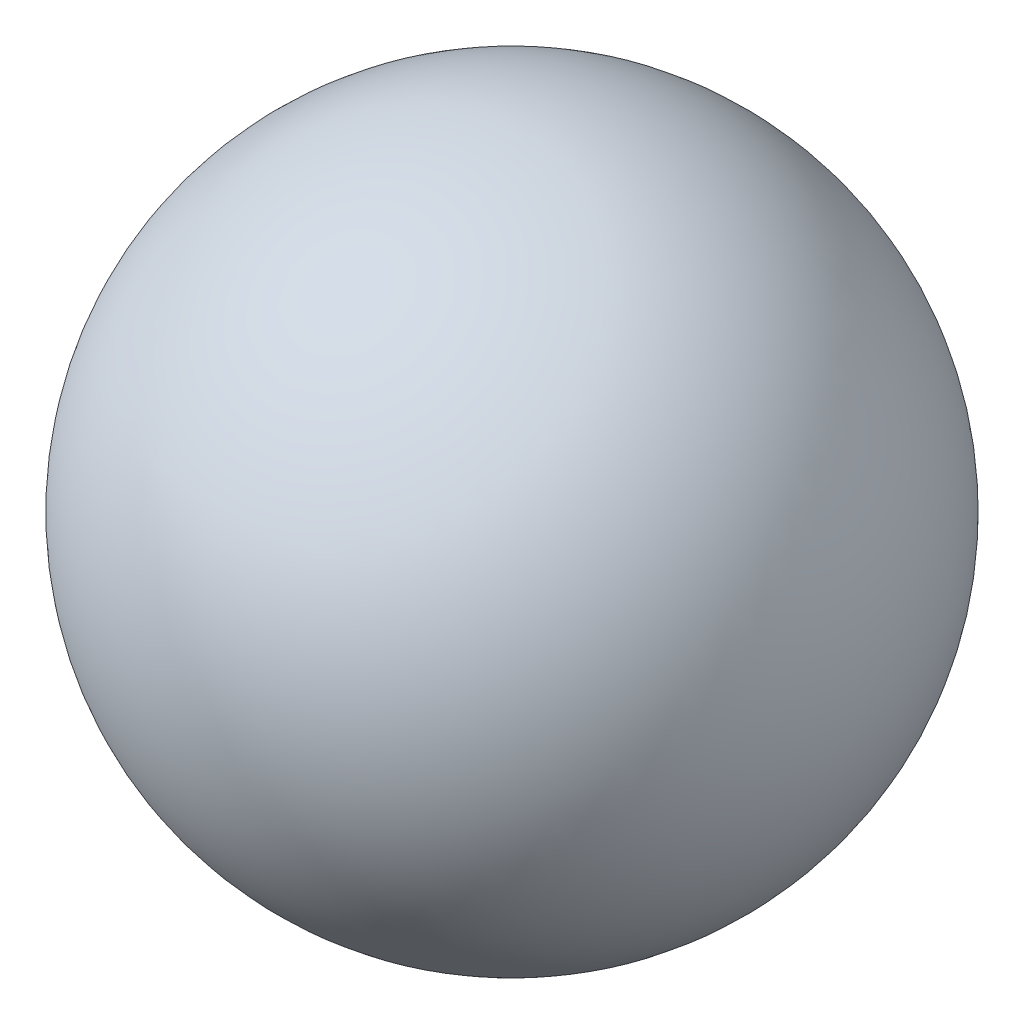
ISO-10303-21;
HEADER;
FILE_DESCRIPTION(('STEP AP214'),'2;1');
FILE_NAME('part.step','',(''),(''),'','','');
FILE_SCHEMA(('AUTOMOTIVE_DESIGN { 1 0 10303 214 1 1 1 1 }'));
ENDSEC;
DATA;
#1=APPLICATION_CONTEXT('core data for automotive mechanical design processes');
#2=APPLICATION_PROTOCOL_DEFINITION('international standard','automotive_design',2000,#1);
#3=PRODUCT_CONTEXT('',#1,'mechanical');
#4=PRODUCT('Part','Part','',(#3));
#5=PRODUCT_RELATED_PRODUCT_CATEGORY('part','',(#4));
#6=PRODUCT_DEFINITION_FORMATION('','',#4);
#7=PRODUCT_DEFINITION_CONTEXT('part definition',#1,'design');
#8=PRODUCT_DEFINITION('design','',#6,#7);
#9=PRODUCT_DEFINITION_SHAPE('','',#8);
#10=(LENGTH_UNIT() NAMED_UNIT(*) SI_UNIT(.MILLI.,.METRE.));
#11=(NAMED_UNIT(*) PLANE_ANGLE_UNIT() SI_UNIT($,.RADIAN.));
#12=(NAMED_UNIT(*) SI_UNIT($,.STERADIAN.) SOLID_ANGLE_UNIT());
#13=UNCERTAINTY_MEASURE_WITH_UNIT(LENGTH_MEASURE(1.E-05),#10,'distance_accuracy_value','');
#14=(GEOMETRIC_REPRESENTATION_CONTEXT(3) GLOBAL_UNCERTAINTY_ASSIGNED_CONTEXT((#13)) GLOBAL_UNIT_ASSIGNED_CONTEXT((#10,
#11,#12)) REPRESENTATION_CONTEXT('',''));
#15=CARTESIAN_POINT('',(0.,0.,0.));
#16=DIRECTION('',(0.,0.,1.));
#17=DIRECTION('',(1.,0.,0.));
#18=AXIS2_PLACEMENT_3D('',#15,#16,#17);
#19=CARTESIAN_POINT('',(0.,0.,0.));
#20=DIRECTION('',(0.,-1.,0.));
#21=DIRECTION('',(-1.,0.,0.));
#22=AXIS2_PLACEMENT_3D('',#19,#20,#21);
#23=SPHERICAL_SURFACE('',#22,0.3);
#24=CARTESIAN_POINT('',(0.,-0.3,0.));
#25=VERTEX_POINT('',#24);
#26=VERTEX_LOOP('',#25);
#27=FACE_BOUND('',#26,.T.);
#28=ADVANCED_FACE('F26',(#27),#23,.T.);
#29=CLOSED_SHELL('',(#28));
#30=MANIFOLD_SOLID_BREP('B2',#29);
#31=ADVANCED_BREP_SHAPE_REPRESENTATION('',(#18,#30),#14);
#32=SHAPE_DEFINITION_REPRESENTATION(#9,#31);
ENDSEC;
END-ISO-10303-21;
